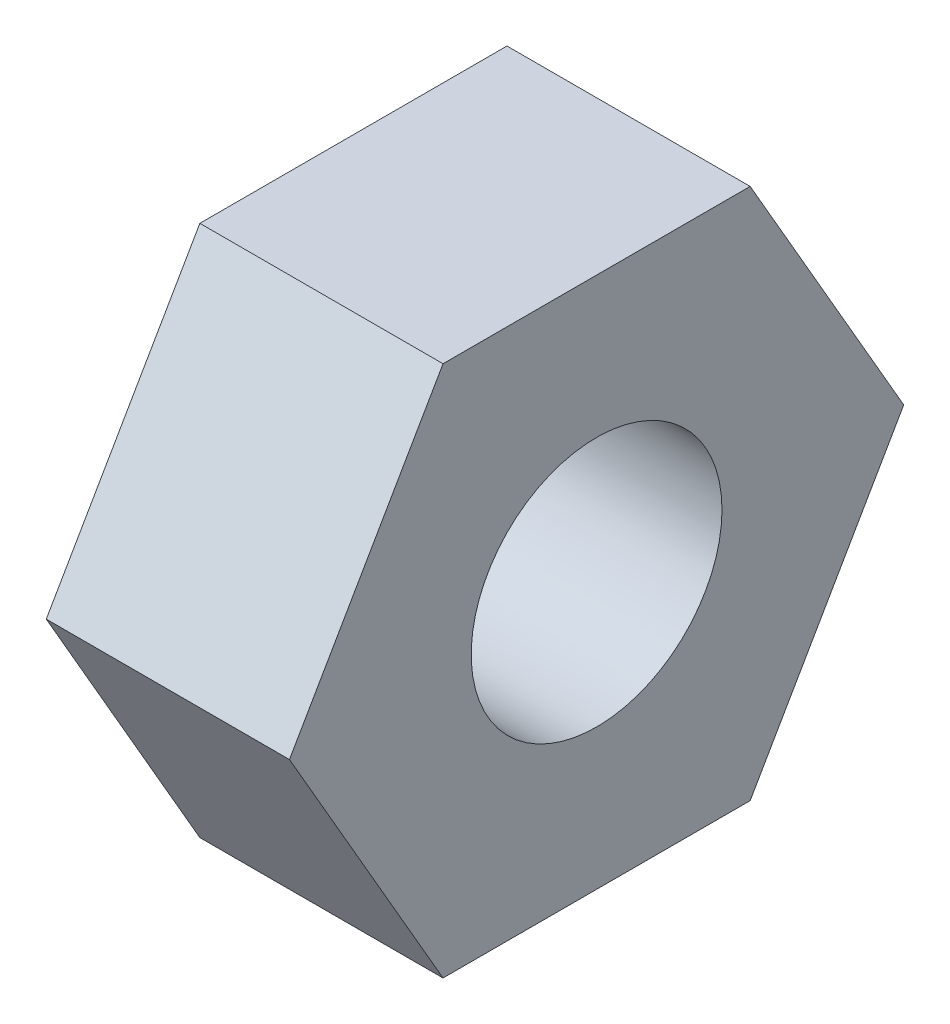
ISO-10303-21;
HEADER;
FILE_DESCRIPTION(('STEP AP214'),'2;1');
FILE_NAME('part.step','',(''),(''),'','','');
FILE_SCHEMA(('AUTOMOTIVE_DESIGN { 1 0 10303 214 1 1 1 1 }'));
ENDSEC;
DATA;
#1=APPLICATION_CONTEXT('core data for automotive mechanical design processes');
#2=APPLICATION_PROTOCOL_DEFINITION('international standard','automotive_design',2000,#1);
#3=PRODUCT_CONTEXT('',#1,'mechanical');
#4=PRODUCT('Part','Part','',(#3));
#5=PRODUCT_RELATED_PRODUCT_CATEGORY('part','',(#4));
#6=PRODUCT_DEFINITION_FORMATION('','',#4);
#7=PRODUCT_DEFINITION_CONTEXT('part definition',#1,'design');
#8=PRODUCT_DEFINITION('design','',#6,#7);
#9=PRODUCT_DEFINITION_SHAPE('','',#8);
#10=(LENGTH_UNIT() NAMED_UNIT(*) SI_UNIT(.MILLI.,.METRE.));
#11=(NAMED_UNIT(*) PLANE_ANGLE_UNIT() SI_UNIT($,.RADIAN.));
#12=(NAMED_UNIT(*) SI_UNIT($,.STERADIAN.) SOLID_ANGLE_UNIT());
#13=UNCERTAINTY_MEASURE_WITH_UNIT(LENGTH_MEASURE(1.E-05),#10,'distance_accuracy_value','');
#14=(GEOMETRIC_REPRESENTATION_CONTEXT(3) GLOBAL_UNCERTAINTY_ASSIGNED_CONTEXT((#13)) GLOBAL_UNIT_ASSIGNED_CONTEXT((#10,
#11,#12)) REPRESENTATION_CONTEXT('',''));
#15=CARTESIAN_POINT('',(0.,0.,0.));
#16=DIRECTION('',(0.,0.,1.));
#17=DIRECTION('',(1.,0.,0.));
#18=AXIS2_PLACEMENT_3D('',#15,#16,#17);
#19=CARTESIAN_POINT('',(3.2,-3.5,-2.02072594216369));
#20=DIRECTION('',(0.,0.5,0.866025403784439));
#21=DIRECTION('',(0.,-0.866025403784439,0.5));
#22=AXIS2_PLACEMENT_3D('',#19,#20,#21);
#23=PLANE('',#22);
#24=DIRECTION('',(0.,0.866025403784439,-0.5));
#25=VECTOR('',#24,1.);
#26=CARTESIAN_POINT('',(0.,-3.5,-2.02072594216369));
#27=LINE('',#26,#25);
#28=CARTESIAN_POINT('',(0.,-3.5,-2.02072594216369));
#29=VERTEX_POINT('',#28);
#30=CARTESIAN_POINT('',(0.,0.,-4.04145188432738));
#31=VERTEX_POINT('',#30);
#32=EDGE_CURVE('E127',#29,#31,#27,.T.);
#33=ORIENTED_EDGE('',*,*,#32,.T.);
#34=DIRECTION('',(-1.,0.,0.));
#35=VECTOR('',#34,1.);
#36=CARTESIAN_POINT('',(3.2,0.,-4.04145188432738));
#37=LINE('',#36,#35);
#38=CARTESIAN_POINT('',(3.2,0.,-4.04145188432738));
#39=VERTEX_POINT('',#38);
#40=EDGE_CURVE('E11',#39,#31,#37,.T.);
#41=ORIENTED_EDGE('',*,*,#40,.F.);
#42=DIRECTION('',(0.,0.866025403784439,-0.5));
#43=VECTOR('',#42,1.);
#44=CARTESIAN_POINT('',(3.2,-3.5,-2.02072594216369));
#45=LINE('',#44,#43);
#46=CARTESIAN_POINT('',(3.2,-3.5,-2.02072594216369));
#47=VERTEX_POINT('',#46);
#48=EDGE_CURVE('E139',#47,#39,#45,.T.);
#49=ORIENTED_EDGE('',*,*,#48,.F.);
#50=DIRECTION('',(-1.,0.,0.));
#51=VECTOR('',#50,1.);
#52=CARTESIAN_POINT('',(3.2,-3.5,-2.02072594216369));
#53=LINE('',#52,#51);
#54=EDGE_CURVE('E124',#47,#29,#53,.T.);
#55=ORIENTED_EDGE('',*,*,#54,.T.);
#56=EDGE_LOOP('',(#33,#41,#49,#55));
#57=FACE_BOUND('',#56,.T.);
#58=ADVANCED_FACE('F41',(#57),#23,.F.);
#59=CARTESIAN_POINT('',(3.2,0.,-4.04145188432738));
#60=DIRECTION('',(0.,-0.5,0.866025403784439));
#61=DIRECTION('',(0.,-0.866025403784439,-0.5));
#62=AXIS2_PLACEMENT_3D('',#59,#60,#61);
#63=PLANE('',#62);
#64=DIRECTION('',(0.,0.866025403784439,0.5));
#65=VECTOR('',#64,1.);
#66=CARTESIAN_POINT('',(0.,0.,-4.04145188432738));
#67=LINE('',#66,#65);
#68=CARTESIAN_POINT('',(0.,3.5,-2.02072594216369));
#69=VERTEX_POINT('',#68);
#70=EDGE_CURVE('E129',#31,#69,#67,.T.);
#71=ORIENTED_EDGE('',*,*,#70,.T.);
#72=DIRECTION('',(-1.,0.,0.));
#73=VECTOR('',#72,1.);
#74=CARTESIAN_POINT('',(3.2,3.5,-2.02072594216369));
#75=LINE('',#74,#73);
#76=CARTESIAN_POINT('',(3.2,3.5,-2.02072594216369));
#77=VERTEX_POINT('',#76);
#78=EDGE_CURVE('E49',#77,#69,#75,.T.);
#79=ORIENTED_EDGE('',*,*,#78,.F.);
#80=DIRECTION('',(0.,0.866025403784439,0.5));
#81=VECTOR('',#80,1.);
#82=CARTESIAN_POINT('',(3.2,0.,-4.04145188432738));
#83=LINE('',#82,#81);
#84=EDGE_CURVE('E92',#39,#77,#83,.T.);
#85=ORIENTED_EDGE('',*,*,#84,.F.);
#86=ORIENTED_EDGE('',*,*,#40,.T.);
#87=EDGE_LOOP('',(#71,#79,#85,#86));
#88=FACE_BOUND('',#87,.T.);
#89=ADVANCED_FACE('F162',(#88),#63,.F.);
#90=CARTESIAN_POINT('',(3.2,3.5,-2.02072594216369));
#91=DIRECTION('',(0.,-1.,0.));
#92=DIRECTION('',(0.,0.,-1.));
#93=AXIS2_PLACEMENT_3D('',#90,#91,#92);
#94=PLANE('',#93);
#95=DIRECTION('',(0.,0.,1.));
#96=VECTOR('',#95,1.);
#97=CARTESIAN_POINT('',(0.,3.5,-2.02072594216369));
#98=LINE('',#97,#96);
#99=CARTESIAN_POINT('',(0.,3.5,2.02072594216369));
#100=VERTEX_POINT('',#99);
#101=EDGE_CURVE('E135',#69,#100,#98,.T.);
#102=ORIENTED_EDGE('',*,*,#101,.T.);
#103=DIRECTION('',(-1.,0.,0.));
#104=VECTOR('',#103,1.);
#105=CARTESIAN_POINT('',(3.2,3.5,2.02072594216369));
#106=LINE('',#105,#104);
#107=CARTESIAN_POINT('',(3.2,3.5,2.02072594216369));
#108=VERTEX_POINT('',#107);
#109=EDGE_CURVE('E120',#108,#100,#106,.T.);
#110=ORIENTED_EDGE('',*,*,#109,.F.);
#111=DIRECTION('',(0.,0.,1.));
#112=VECTOR('',#111,1.);
#113=CARTESIAN_POINT('',(3.2,3.5,-2.02072594216369));
#114=LINE('',#113,#112);
#115=EDGE_CURVE('E107',#77,#108,#114,.T.);
#116=ORIENTED_EDGE('',*,*,#115,.F.);
#117=ORIENTED_EDGE('',*,*,#78,.T.);
#118=EDGE_LOOP('',(#102,#110,#116,#117));
#119=FACE_BOUND('',#118,.T.);
#120=ADVANCED_FACE('F145',(#119),#94,.F.);
#121=CARTESIAN_POINT('',(3.2,3.5,2.02072594216369));
#122=DIRECTION('',(0.,-0.5,-0.866025403784438));
#123=DIRECTION('',(0.,0.866025403784439,-0.5));
#124=AXIS2_PLACEMENT_3D('',#121,#122,#123);
#125=PLANE('',#124);
#126=DIRECTION('',(0.,-0.866025403784438,0.5));
#127=VECTOR('',#126,1.);
#128=CARTESIAN_POINT('',(0.,3.5,2.02072594216369));
#129=LINE('',#128,#127);
#130=CARTESIAN_POINT('',(0.,0.,4.04145188432738));
#131=VERTEX_POINT('',#130);
#132=EDGE_CURVE('E116',#100,#131,#129,.T.);
#133=ORIENTED_EDGE('',*,*,#132,.T.);
#134=DIRECTION('',(-1.,0.,0.));
#135=VECTOR('',#134,1.);
#136=CARTESIAN_POINT('',(3.2,0.,4.04145188432738));
#137=LINE('',#136,#135);
#138=CARTESIAN_POINT('',(3.2,0.,4.04145188432738));
#139=VERTEX_POINT('',#138);
#140=EDGE_CURVE('E114',#139,#131,#137,.T.);
#141=ORIENTED_EDGE('',*,*,#140,.F.);
#142=DIRECTION('',(0.,-0.866025403784438,0.5));
#143=VECTOR('',#142,1.);
#144=CARTESIAN_POINT('',(3.2,3.5,2.02072594216369));
#145=LINE('',#144,#143);
#146=EDGE_CURVE('E105',#108,#139,#145,.T.);
#147=ORIENTED_EDGE('',*,*,#146,.F.);
#148=ORIENTED_EDGE('',*,*,#109,.T.);
#149=EDGE_LOOP('',(#133,#141,#147,#148));
#150=FACE_BOUND('',#149,.T.);
#151=ADVANCED_FACE('F111',(#150),#125,.F.);
#152=CARTESIAN_POINT('',(3.2,0.,4.04145188432738));
#153=DIRECTION('',(0.,0.5,-0.866025403784439));
#154=DIRECTION('',(0.,0.866025403784439,0.5));
#155=AXIS2_PLACEMENT_3D('',#152,#153,#154);
#156=PLANE('',#155);
#157=DIRECTION('',(0.,-0.866025403784439,-0.5));
#158=VECTOR('',#157,1.);
#159=CARTESIAN_POINT('',(0.,0.,4.04145188432738));
#160=LINE('',#159,#158);
#161=CARTESIAN_POINT('',(0.,-3.5,2.02072594216369));
#162=VERTEX_POINT('',#161);
#163=EDGE_CURVE('E83',#131,#162,#160,.T.);
#164=ORIENTED_EDGE('',*,*,#163,.T.);
#165=DIRECTION('',(-1.,0.,0.));
#166=VECTOR('',#165,1.);
#167=CARTESIAN_POINT('',(3.2,-3.5,2.02072594216369));
#168=LINE('',#167,#166);
#169=CARTESIAN_POINT('',(3.2,-3.5,2.02072594216369));
#170=VERTEX_POINT('',#169);
#171=EDGE_CURVE('E117',#170,#162,#168,.T.);
#172=ORIENTED_EDGE('',*,*,#171,.F.);
#173=DIRECTION('',(0.,-0.866025403784439,-0.5));
#174=VECTOR('',#173,1.);
#175=CARTESIAN_POINT('',(3.2,0.,4.04145188432738));
#176=LINE('',#175,#174);
#177=EDGE_CURVE('E106',#139,#170,#176,.T.);
#178=ORIENTED_EDGE('',*,*,#177,.F.);
#179=ORIENTED_EDGE('',*,*,#140,.T.);
#180=EDGE_LOOP('',(#164,#172,#178,#179));
#181=FACE_BOUND('',#180,.T.);
#182=ADVANCED_FACE('F119',(#181),#156,.F.);
#183=CARTESIAN_POINT('',(3.2,-3.5,2.02072594216369));
#184=DIRECTION('',(0.,1.,0.));
#185=DIRECTION('',(0.,0.,1.));
#186=AXIS2_PLACEMENT_3D('',#183,#184,#185);
#187=PLANE('',#186);
#188=DIRECTION('',(0.,0.,-1.));
#189=VECTOR('',#188,1.);
#190=CARTESIAN_POINT('',(0.,-3.5,2.02072594216369));
#191=LINE('',#190,#189);
#192=EDGE_CURVE('E87',#162,#29,#191,.T.);
#193=ORIENTED_EDGE('',*,*,#192,.T.);
#194=ORIENTED_EDGE('',*,*,#54,.F.);
#195=DIRECTION('',(0.,0.,-1.));
#196=VECTOR('',#195,1.);
#197=CARTESIAN_POINT('',(3.2,-3.5,2.02072594216369));
#198=LINE('',#197,#196);
#199=EDGE_CURVE('E59',#170,#47,#198,.T.);
#200=ORIENTED_EDGE('',*,*,#199,.F.);
#201=ORIENTED_EDGE('',*,*,#171,.T.);
#202=EDGE_LOOP('',(#193,#194,#200,#201));
#203=FACE_BOUND('',#202,.T.);
#204=ADVANCED_FACE('F151',(#203),#187,.F.);
#205=CARTESIAN_POINT('',(3.2,0.,0.));
#206=DIRECTION('',(1.,0.,0.));
#207=DIRECTION('',(0.,0.,-1.));
#208=AXIS2_PLACEMENT_3D('',#205,#206,#207);
#209=PLANE('',#208);
#210=CARTESIAN_POINT('',(3.20000000000009,0.,0.));
#211=DIRECTION('',(1.,0.,0.));
#212=DIRECTION('',(0.,0.,-1.));
#213=AXIS2_PLACEMENT_3D('',#210,#211,#212);
#214=CIRCLE('',#213,1.65);
#215=CARTESIAN_POINT('',(3.20000000000009,0.,-1.65));
#216=VERTEX_POINT('',#215);
#217=EDGE_CURVE('E128',#216,#216,#214,.F.);
#218=ORIENTED_EDGE('',*,*,#217,.T.);
#219=EDGE_LOOP('',(#218));
#220=FACE_BOUND('',#219,.T.);
#221=ORIENTED_EDGE('',*,*,#48,.T.);
#222=ORIENTED_EDGE('',*,*,#84,.T.);
#223=ORIENTED_EDGE('',*,*,#115,.T.);
#224=ORIENTED_EDGE('',*,*,#146,.T.);
#225=ORIENTED_EDGE('',*,*,#177,.T.);
#226=ORIENTED_EDGE('',*,*,#199,.T.);
#227=EDGE_LOOP('',(#221,#222,#223,#224,#225,#226));
#228=FACE_BOUND('',#227,.T.);
#229=ADVANCED_FACE('F102',(#220,#228),#209,.T.);
#230=CARTESIAN_POINT('',(0.,0.,0.));
#231=DIRECTION('',(1.,0.,0.));
#232=DIRECTION('',(0.,0.,-1.));
#233=AXIS2_PLACEMENT_3D('',#230,#231,#232);
#234=PLANE('',#233);
#235=CARTESIAN_POINT('',(0.,0.,0.));
#236=DIRECTION('',(1.,0.,0.));
#237=DIRECTION('',(0.,0.,-1.));
#238=AXIS2_PLACEMENT_3D('',#235,#236,#237);
#239=CIRCLE('',#238,1.65);
#240=CARTESIAN_POINT('',(0.,0.,-1.65));
#241=VERTEX_POINT('',#240);
#242=EDGE_CURVE('E42',#241,#241,#239,.F.);
#243=ORIENTED_EDGE('',*,*,#242,.F.);
#244=EDGE_LOOP('',(#243));
#245=FACE_BOUND('',#244,.T.);
#246=ORIENTED_EDGE('',*,*,#32,.F.);
#247=ORIENTED_EDGE('',*,*,#192,.F.);
#248=ORIENTED_EDGE('',*,*,#163,.F.);
#249=ORIENTED_EDGE('',*,*,#132,.F.);
#250=ORIENTED_EDGE('',*,*,#101,.F.);
#251=ORIENTED_EDGE('',*,*,#70,.F.);
#252=EDGE_LOOP('',(#246,#247,#248,#249,#250,#251));
#253=FACE_BOUND('',#252,.T.);
#254=ADVANCED_FACE('F150',(#245,#253),#234,.F.);
#255=CARTESIAN_POINT('',(-1000.,0.,0.));
#256=DIRECTION('',(-1.,0.,0.));
#257=DIRECTION('',(0.,0.,1.));
#258=AXIS2_PLACEMENT_3D('',#255,#256,#257);
#259=CYLINDRICAL_SURFACE('',#258,1.65);
#260=ORIENTED_EDGE('',*,*,#217,.F.);
#261=EDGE_LOOP('',(#260));
#262=FACE_BOUND('',#261,.T.);
#263=ORIENTED_EDGE('',*,*,#242,.T.);
#264=EDGE_LOOP('',(#263));
#265=FACE_BOUND('',#264,.T.);
#266=ADVANCED_FACE('F205',(#262,#265),#259,.F.);
#267=CLOSED_SHELL('',(#58,#89,#120,#151,#182,#204,#229,#254,#266));
#268=MANIFOLD_SOLID_BREP('B2',#267);
#269=ADVANCED_BREP_SHAPE_REPRESENTATION('',(#18,#268),#14);
#270=SHAPE_DEFINITION_REPRESENTATION(#9,#269);
ENDSEC;
END-ISO-10303-21;
